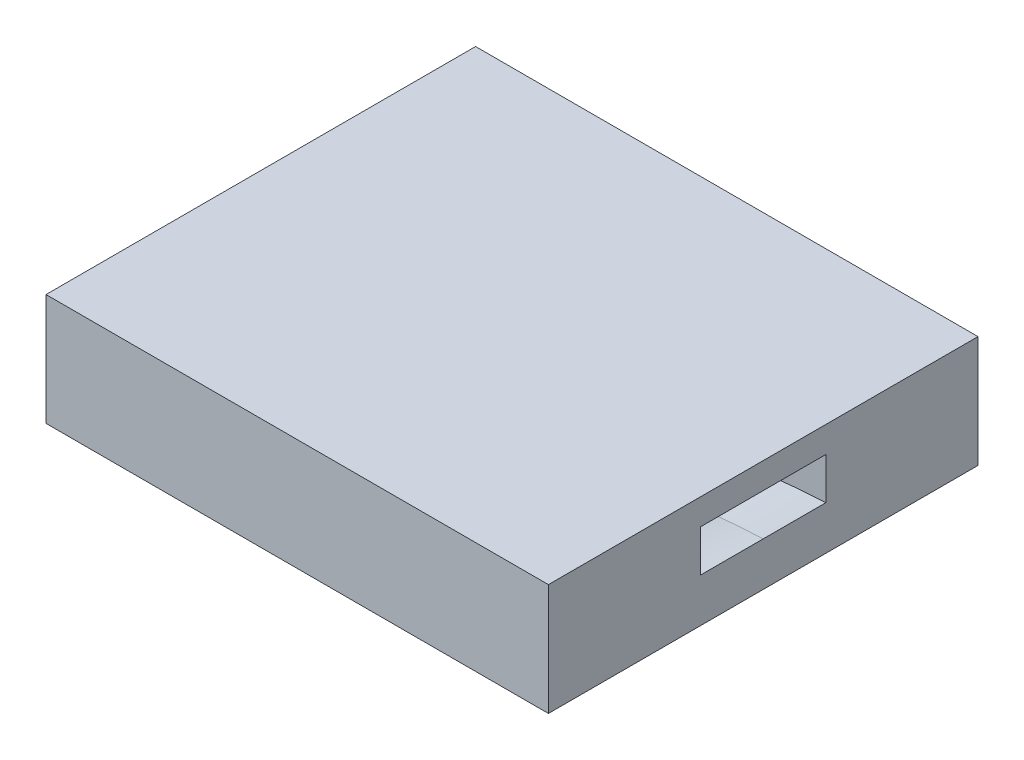
ISO-10303-21;
HEADER;
FILE_DESCRIPTION(('STEP AP214'),'2;1');
FILE_NAME('part.step','',(''),(''),'','','');
FILE_SCHEMA(('AUTOMOTIVE_DESIGN { 1 0 10303 214 1 1 1 1 }'));
ENDSEC;
DATA;
#1=APPLICATION_CONTEXT('core data for automotive mechanical design processes');
#2=APPLICATION_PROTOCOL_DEFINITION('international standard','automotive_design',2000,#1);
#3=PRODUCT_CONTEXT('',#1,'mechanical');
#4=PRODUCT('Part','Part','',(#3));
#5=PRODUCT_RELATED_PRODUCT_CATEGORY('part','',(#4));
#6=PRODUCT_DEFINITION_FORMATION('','',#4);
#7=PRODUCT_DEFINITION_CONTEXT('part definition',#1,'design');
#8=PRODUCT_DEFINITION('design','',#6,#7);
#9=PRODUCT_DEFINITION_SHAPE('','',#8);
#10=(LENGTH_UNIT() NAMED_UNIT(*) SI_UNIT(.MILLI.,.METRE.));
#11=(NAMED_UNIT(*) PLANE_ANGLE_UNIT() SI_UNIT($,.RADIAN.));
#12=(NAMED_UNIT(*) SI_UNIT($,.STERADIAN.) SOLID_ANGLE_UNIT());
#13=UNCERTAINTY_MEASURE_WITH_UNIT(LENGTH_MEASURE(1.E-05),#10,'distance_accuracy_value','');
#14=(GEOMETRIC_REPRESENTATION_CONTEXT(3) GLOBAL_UNCERTAINTY_ASSIGNED_CONTEXT((#13)) GLOBAL_UNIT_ASSIGNED_CONTEXT((#10,
#11,#12)) REPRESENTATION_CONTEXT('',''));
#15=CARTESIAN_POINT('',(0.,0.,0.));
#16=DIRECTION('',(0.,0.,1.));
#17=DIRECTION('',(1.,0.,0.));
#18=AXIS2_PLACEMENT_3D('',#15,#16,#17);
#19=CARTESIAN_POINT('',(40.5114922655486,18.,-34.6394807536539));
#20=DIRECTION('',(-1.,0.,0.));
#21=DIRECTION('',(0.,0.,1.));
#22=AXIS2_PLACEMENT_3D('',#19,#20,#21);
#23=PLANE('',#22);
#24=DIRECTION('',(0.,-1.,0.));
#25=VECTOR('',#24,1.);
#26=CARTESIAN_POINT('',(40.5114922655486,13.8041420215105,10.1010165580472));
#27=LINE('',#26,#25);
#28=CARTESIAN_POINT('',(40.5114922655486,13.8041420215105,10.1010165580472));
#29=VERTEX_POINT('',#28);
#30=CARTESIAN_POINT('',(40.5114922655486,7.07013098281241,10.1010165580472));
#31=VERTEX_POINT('',#30);
#32=EDGE_CURVE('E89',#29,#31,#27,.T.);
#33=ORIENTED_EDGE('',*,*,#32,.F.);
#34=DIRECTION('',(0.,0.,1.));
#35=VECTOR('',#34,1.);
#36=CARTESIAN_POINT('',(40.5114922655486,13.8041420215105,10.1010165580472));
#37=LINE('',#36,#35);
#38=CARTESIAN_POINT('',(40.5114922655486,13.8041420215105,0.));
#39=VERTEX_POINT('',#38);
#40=EDGE_CURVE('E243',#39,#29,#37,.T.);
#41=ORIENTED_EDGE('',*,*,#40,.F.);
#42=CARTESIAN_POINT('',(40.5114922655486,13.8041420215105,-10.1010165580472));
#43=VERTEX_POINT('',#42);
#44=EDGE_CURVE('E209',#43,#39,#37,.T.);
#45=ORIENTED_EDGE('',*,*,#44,.F.);
#46=DIRECTION('',(0.,1.,0.));
#47=VECTOR('',#46,1.);
#48=CARTESIAN_POINT('',(40.5114922655486,13.8041420215105,-10.1010165580472));
#49=LINE('',#48,#47);
#50=CARTESIAN_POINT('',(40.5114922655486,7.07013098281241,-10.1010165580472));
#51=VERTEX_POINT('',#50);
#52=EDGE_CURVE('E190',#51,#43,#49,.T.);
#53=ORIENTED_EDGE('',*,*,#52,.F.);
#54=DIRECTION('',(0.,0.,-1.));
#55=VECTOR('',#54,1.);
#56=CARTESIAN_POINT('',(40.5114922655486,7.07013098281241,10.1010165580472));
#57=LINE('',#56,#55);
#58=CARTESIAN_POINT('',(40.5114922655486,7.07013098281241,0.));
#59=VERTEX_POINT('',#58);
#60=EDGE_CURVE('E176',#59,#51,#57,.T.);
#61=ORIENTED_EDGE('',*,*,#60,.F.);
#62=EDGE_CURVE('E189',#31,#59,#57,.T.);
#63=ORIENTED_EDGE('',*,*,#62,.F.);
#64=EDGE_LOOP('',(#33,#41,#45,#53,#61,#63));
#65=FACE_BOUND('',#64,.T.);
#66=DIRECTION('',(0.,0.,-1.));
#67=VECTOR('',#66,1.);
#68=CARTESIAN_POINT('',(40.5114922655486,0.,-34.6394807536539));
#69=LINE('',#68,#67);
#70=CARTESIAN_POINT('',(40.5114922655486,0.,34.6394807536539));
#71=VERTEX_POINT('',#70);
#72=CARTESIAN_POINT('',(40.5114922655486,0.,-34.6394807536539));
#73=VERTEX_POINT('',#72);
#74=EDGE_CURVE('E305',#71,#73,#69,.T.);
#75=ORIENTED_EDGE('',*,*,#74,.T.);
#76=DIRECTION('',(0.,-1.,0.));
#77=VECTOR('',#76,1.);
#78=CARTESIAN_POINT('',(40.5114922655486,18.,-34.6394807536539));
#79=LINE('',#78,#77);
#80=CARTESIAN_POINT('',(40.5114922655486,18.,-34.6394807536539));
#81=VERTEX_POINT('',#80);
#82=EDGE_CURVE('E12',#81,#73,#79,.T.);
#83=ORIENTED_EDGE('',*,*,#82,.F.);
#84=DIRECTION('',(0.,0.,-1.));
#85=VECTOR('',#84,1.);
#86=CARTESIAN_POINT('',(40.5114922655486,18.,-34.6394807536539));
#87=LINE('',#86,#85);
#88=CARTESIAN_POINT('',(40.5114922655486,18.,34.6394807536539));
#89=VERTEX_POINT('',#88);
#90=EDGE_CURVE('E298',#89,#81,#87,.T.);
#91=ORIENTED_EDGE('',*,*,#90,.F.);
#92=DIRECTION('',(0.,-1.,0.));
#93=VECTOR('',#92,1.);
#94=CARTESIAN_POINT('',(40.5114922655486,18.,34.6394807536539));
#95=LINE('',#94,#93);
#96=EDGE_CURVE('E293',#89,#71,#95,.T.);
#97=ORIENTED_EDGE('',*,*,#96,.T.);
#98=EDGE_LOOP('',(#75,#83,#91,#97));
#99=FACE_BOUND('',#98,.T.);
#100=ADVANCED_FACE('F85',(#65,#99),#23,.F.);
#101=CARTESIAN_POINT('',(-40.5114922655486,18.,-34.6394807536539));
#102=DIRECTION('',(0.,0.,1.));
#103=DIRECTION('',(1.,0.,0.));
#104=AXIS2_PLACEMENT_3D('',#101,#102,#103);
#105=PLANE('',#104);
#106=DIRECTION('',(-1.,0.,0.));
#107=VECTOR('',#106,1.);
#108=CARTESIAN_POINT('',(-40.5114922655486,0.,-34.6394807536539));
#109=LINE('',#108,#107);
#110=CARTESIAN_POINT('',(-40.5114922655486,0.,-34.6394807536539));
#111=VERTEX_POINT('',#110);
#112=EDGE_CURVE('E302',#73,#111,#109,.T.);
#113=ORIENTED_EDGE('',*,*,#112,.T.);
#114=DIRECTION('',(0.,-1.,0.));
#115=VECTOR('',#114,1.);
#116=CARTESIAN_POINT('',(-40.5114922655486,18.,-34.6394807536539));
#117=LINE('',#116,#115);
#118=CARTESIAN_POINT('',(-40.5114922655486,18.,-34.6394807536539));
#119=VERTEX_POINT('',#118);
#120=EDGE_CURVE('E96',#119,#111,#117,.T.);
#121=ORIENTED_EDGE('',*,*,#120,.F.);
#122=DIRECTION('',(-1.,0.,0.));
#123=VECTOR('',#122,1.);
#124=CARTESIAN_POINT('',(-40.5114922655486,18.,-34.6394807536539));
#125=LINE('',#124,#123);
#126=EDGE_CURVE('E141',#81,#119,#125,.T.);
#127=ORIENTED_EDGE('',*,*,#126,.F.);
#128=ORIENTED_EDGE('',*,*,#82,.T.);
#129=EDGE_LOOP('',(#113,#121,#127,#128));
#130=FACE_BOUND('',#129,.T.);
#131=ADVANCED_FACE('F577',(#130),#105,.F.);
#132=CARTESIAN_POINT('',(-40.5114922655486,18.,-34.6394807536539));
#133=DIRECTION('',(1.,0.,0.));
#134=DIRECTION('',(0.,0.,-1.));
#135=AXIS2_PLACEMENT_3D('',#132,#133,#134);
#136=PLANE('',#135);
#137=DIRECTION('',(0.,0.,1.));
#138=VECTOR('',#137,1.);
#139=CARTESIAN_POINT('',(-40.5114922655486,0.,-34.6394807536539));
#140=LINE('',#139,#138);
#141=CARTESIAN_POINT('',(-40.5114922655486,0.,34.6394807536539));
#142=VERTEX_POINT('',#141);
#143=EDGE_CURVE('E299',#111,#142,#140,.T.);
#144=ORIENTED_EDGE('',*,*,#143,.T.);
#145=DIRECTION('',(0.,-1.,0.));
#146=VECTOR('',#145,1.);
#147=CARTESIAN_POINT('',(-40.5114922655486,18.,34.6394807536539));
#148=LINE('',#147,#146);
#149=CARTESIAN_POINT('',(-40.5114922655486,18.,34.6394807536539));
#150=VERTEX_POINT('',#149);
#151=EDGE_CURVE('E290',#150,#142,#148,.T.);
#152=ORIENTED_EDGE('',*,*,#151,.F.);
#153=DIRECTION('',(0.,0.,1.));
#154=VECTOR('',#153,1.);
#155=CARTESIAN_POINT('',(-40.5114922655486,18.,-34.6394807536539));
#156=LINE('',#155,#154);
#157=EDGE_CURVE('E312',#119,#150,#156,.T.);
#158=ORIENTED_EDGE('',*,*,#157,.F.);
#159=ORIENTED_EDGE('',*,*,#120,.T.);
#160=EDGE_LOOP('',(#144,#152,#158,#159));
#161=FACE_BOUND('',#160,.T.);
#162=ADVANCED_FACE('F581',(#161),#136,.F.);
#163=CARTESIAN_POINT('',(-40.5114922655486,18.,34.6394807536539));
#164=DIRECTION('',(0.,0.,-1.));
#165=DIRECTION('',(-1.,0.,0.));
#166=AXIS2_PLACEMENT_3D('',#163,#164,#165);
#167=PLANE('',#166);
#168=DIRECTION('',(1.,0.,0.));
#169=VECTOR('',#168,1.);
#170=CARTESIAN_POINT('',(-40.5114922655486,0.,34.6394807536539));
#171=LINE('',#170,#169);
#172=EDGE_CURVE('E134',#142,#71,#171,.T.);
#173=ORIENTED_EDGE('',*,*,#172,.T.);
#174=ORIENTED_EDGE('',*,*,#96,.F.);
#175=DIRECTION('',(1.,0.,0.));
#176=VECTOR('',#175,1.);
#177=CARTESIAN_POINT('',(-40.5114922655486,18.,34.6394807536539));
#178=LINE('',#177,#176);
#179=EDGE_CURVE('E113',#150,#89,#178,.T.);
#180=ORIENTED_EDGE('',*,*,#179,.F.);
#181=ORIENTED_EDGE('',*,*,#151,.T.);
#182=EDGE_LOOP('',(#173,#174,#180,#181));
#183=FACE_BOUND('',#182,.T.);
#184=ADVANCED_FACE('F585',(#183),#167,.F.);
#185=CARTESIAN_POINT('',(0.,18.,0.));
#186=DIRECTION('',(0.,1.,0.));
#187=DIRECTION('',(0.,0.,1.));
#188=AXIS2_PLACEMENT_3D('',#185,#186,#187);
#189=PLANE('',#188);
#190=ORIENTED_EDGE('',*,*,#90,.T.);
#191=ORIENTED_EDGE('',*,*,#126,.T.);
#192=ORIENTED_EDGE('',*,*,#157,.T.);
#193=ORIENTED_EDGE('',*,*,#179,.T.);
#194=EDGE_LOOP('',(#190,#191,#192,#193));
#195=FACE_BOUND('',#194,.T.);
#196=ADVANCED_FACE('F343',(#195),#189,.T.);
#197=CARTESIAN_POINT('',(0.,0.,0.));
#198=DIRECTION('',(0.,1.,0.));
#199=DIRECTION('',(0.,0.,1.));
#200=AXIS2_PLACEMENT_3D('',#197,#198,#199);
#201=PLANE('',#200);
#202=ORIENTED_EDGE('',*,*,#74,.F.);
#203=ORIENTED_EDGE('',*,*,#172,.F.);
#204=ORIENTED_EDGE('',*,*,#143,.F.);
#205=ORIENTED_EDGE('',*,*,#112,.F.);
#206=EDGE_LOOP('',(#202,#203,#204,#205));
#207=FACE_BOUND('',#206,.T.);
#208=ADVANCED_FACE('F336',(#207),#201,.F.);
#209=CARTESIAN_POINT('',(-24.4885077344514,9.26129754584731,25.9804417014075));
#210=DIRECTION('',(1.,0.,0.));
#211=DIRECTION('',(0.,0.,-1.));
#212=AXIS2_PLACEMENT_3D('',#209,#210,#211);
#213=PLANE('',#212);
#214=CARTESIAN_POINT('',(-24.4885077344514,9.26129754584731,25.9804417014075));
#215=DIRECTION('',(1.,0.,0.));
#216=DIRECTION('',(0.,0.,-1.));
#217=AXIS2_PLACEMENT_3D('',#214,#215,#216);
#218=CIRCLE('',#217,3.4390617686198);
#219=CARTESIAN_POINT('',(-24.4885077344514,7.5417666615374,28.9587565582161));
#220=VERTEX_POINT('',#219);
#221=CARTESIAN_POINT('',(-24.4885077344514,5.82223577722751,25.9804417014075));
#222=VERTEX_POINT('',#221);
#223=EDGE_CURVE('E309',#220,#222,#218,.T.);
#224=ORIENTED_EDGE('',*,*,#223,.T.);
#225=CARTESIAN_POINT('',(-24.4885077344514,7.54176666153744,23.0021268445989));
#226=VERTEX_POINT('',#225);
#227=EDGE_CURVE('E398',#222,#226,#218,.T.);
#228=ORIENTED_EDGE('',*,*,#227,.T.);
#229=CARTESIAN_POINT('',(-24.4885077344514,10.9808284301572,23.0021268445989));
#230=VERTEX_POINT('',#229);
#231=EDGE_CURVE('E200',#226,#230,#218,.T.);
#232=ORIENTED_EDGE('',*,*,#231,.T.);
#233=CARTESIAN_POINT('',(-24.4885077344514,12.7003593144671,25.9804417014075));
#234=VERTEX_POINT('',#233);
#235=EDGE_CURVE('E382',#230,#234,#218,.T.);
#236=ORIENTED_EDGE('',*,*,#235,.T.);
#237=CARTESIAN_POINT('',(-24.4885077344514,10.9808284301572,28.9587565582161));
#238=VERTEX_POINT('',#237);
#239=EDGE_CURVE('E374',#234,#238,#218,.T.);
#240=ORIENTED_EDGE('',*,*,#239,.T.);
#241=EDGE_CURVE('E383',#238,#220,#218,.T.);
#242=ORIENTED_EDGE('',*,*,#241,.T.);
#243=EDGE_LOOP('',(#224,#228,#232,#236,#240,#242));
#244=FACE_BOUND('',#243,.T.);
#245=ADVANCED_FACE('F325',(#244),#213,.T.);
#246=CARTESIAN_POINT('',(40.5114922655486,13.8041420215105,10.1010165580472));
#247=CARTESIAN_POINT('',(26.2652590417176,14.5078750939499,7.59727477368613));
#248=CARTESIAN_POINT('',(1.69629967471699,14.7834388296803,7.98696086227721));
#249=CARTESIAN_POINT('',(-17.0680742916158,12.6256660330477,20.1691014404654));
#250=CARTESIAN_POINT('',(-24.4885077344514,10.9808284301572,28.9587565582161));
#251=CARTESIAN_POINT('',(40.5114922655486,13.8041420215105,6.73401103869813));
#252=CARTESIAN_POINT('',(26.1994032451109,15.0724581055229,4.87805915649256));
#253=CARTESIAN_POINT('',(1.76416764547779,15.6997741748645,5.97217098392083));
#254=CARTESIAN_POINT('',(-17.1339300882224,14.0630841246415,19.4112405164155));
#255=CARTESIAN_POINT('',(-24.4885077344514,12.0447224973236,28.3445170321483));
#256=CARTESIAN_POINT('',(40.5114922655486,13.8041420215105,3.36700551934904));
#257=CARTESIAN_POINT('',(26.1335474485043,15.637041117096,2.15884353929899));
#258=CARTESIAN_POINT('',(1.83203561623858,16.8773199931211,4.29095471377893));
#259=CARTESIAN_POINT('',(-17.1997858848291,15.0922449662126,18.1320228398281));
#260=CARTESIAN_POINT('',(-24.4885077344514,12.7003593144671,27.208920753543));
#261=CARTESIAN_POINT('',(40.5114922655486,13.8041420215105,0.));
#262=CARTESIAN_POINT('',(26.0676916518976,16.2016241286691,-0.560372077894577));
#263=CARTESIAN_POINT('',(1.89990358699937,18.4743542666597,2.66916654494503));
#264=CARTESIAN_POINT('',(-17.2656416814357,15.4657689906401,16.7599223897105));
#265=CARTESIAN_POINT('',(-24.4885077344514,12.7003593144671,25.9804417014075));
#266=B_SPLINE_SURFACE_WITH_KNOTS('',3,3,((#246,#247,#248,#249,#250),(#251,#252,#253,#254,#255),
(#256,#257,#258,#259,#260),(#261,#262,#263,#264,#265)),.UNSPECIFIED.,.F.,.F.,.F.,(4,4),(4,1,4),
(0.,1.),(0.,0.561333604135169,1.),.UNSPECIFIED.);
#267=CARTESIAN_POINT('',(40.5114922655486,13.8041420215105,10.1010165580472));
#268=CARTESIAN_POINT('',(26.2652590417176,14.5078750939499,7.59727477368613));
#269=CARTESIAN_POINT('',(1.69629967471699,14.7834388296803,7.98696086227721));
#270=CARTESIAN_POINT('',(-17.0680742916158,12.6256660330477,20.1691014404654));
#271=CARTESIAN_POINT('',(-24.4885077344514,10.9808284301572,28.9587565582161));
#272=B_SPLINE_CURVE_WITH_KNOTS('',3,(#267,#268,#269,#270,#271),.UNSPECIFIED.,.F.,.F.,(4,1,4),
(0.,0.561333604135169,1.),.UNSPECIFIED.);
#273=EDGE_CURVE('E269',#238,#29,#272,.F.);
#274=CARTESIAN_POINT('',(40.5114922655486,13.8041420215105,0.));
#275=CARTESIAN_POINT('',(26.0676916518976,16.2016241286691,-0.560372077894577));
#276=CARTESIAN_POINT('',(1.89990358699937,18.4743542666597,2.66916654494503));
#277=CARTESIAN_POINT('',(-17.2656416814357,15.4657689906401,16.7599223897105));
#278=CARTESIAN_POINT('',(-24.4885077344514,12.7003593144671,25.9804417014075));
#279=B_SPLINE_CURVE_WITH_KNOTS('',3,(#274,#275,#276,#277,#278),.UNSPECIFIED.,.F.,.F.,(4,1,4),
(0.,0.561333604135169,1.),.UNSPECIFIED.);
#280=EDGE_CURVE('E506',#39,#234,#279,.T.);
#281=ORIENTED_EDGE('',*,*,#40,.T.);
#282=ORIENTED_EDGE('',*,*,#273,.F.);
#283=ORIENTED_EDGE('',*,*,#239,.F.);
#284=ORIENTED_EDGE('',*,*,#280,.F.);
#285=EDGE_LOOP('',(#281,#282,#283,#284));
#286=FACE_BOUND('',#285,.T.);
#287=ADVANCED_FACE('F335',(#286),#266,.F.);
#288=CARTESIAN_POINT('',(40.5114922655486,13.8041420215105,0.));
#289=CARTESIAN_POINT('',(26.0676916518976,16.2016241286691,-0.560372077894577));
#290=CARTESIAN_POINT('',(1.89990358699937,18.4743542666597,2.66916654494503));
#291=CARTESIAN_POINT('',(-17.2656416814357,15.4657689906401,16.7599223897105));
#292=CARTESIAN_POINT('',(-24.4885077344514,12.7003593144671,25.9804417014075));
#293=CARTESIAN_POINT('',(40.5114922655486,13.8041420215105,-3.36700551934911));
#294=CARTESIAN_POINT('',(26.0244323052657,15.6323016360664,-3.27666263562429));
#295=CARTESIAN_POINT('',(1.94448469031334,16.8822042854161,1.04436394366338));
#296=CARTESIAN_POINT('',(-17.3089010280676,15.087505485183,15.3907469990567));
#297=CARTESIAN_POINT('',(-24.4885077344514,12.7003593144671,24.751962649272));
#298=CARTESIAN_POINT('',(40.5114922655486,13.8041420215105,-6.73401103869816));
#299=CARTESIAN_POINT('',(25.9811729586338,15.0629791434637,-5.992953193354));
#300=CARTESIAN_POINT('',(1.98906579362733,15.7095427594544,-0.639866758926286));
#301=CARTESIAN_POINT('',(-17.3521603746995,14.0536051625823,14.1144543819331));
#302=CARTESIAN_POINT('',(-24.4885077344514,12.0447224973236,23.6163663706667));
#303=CARTESIAN_POINT('',(40.5114922655486,13.8041420215105,-10.1010165580472));
#304=CARTESIAN_POINT('',(25.9379136120019,14.4936566508609,-8.70924375108372));
#305=CARTESIAN_POINT('',(2.0336468969413,14.7980917065652,-2.65767106973041));
#306=CARTESIAN_POINT('',(-17.3954197213314,12.6114475899587,13.359518517347));
#307=CARTESIAN_POINT('',(-24.4885077344514,10.9808284301572,23.0021268445989));
#308=B_SPLINE_SURFACE_WITH_KNOTS('',3,3,((#288,#289,#290,#291,#292),(#293,#294,#295,#296,#297),
(#298,#299,#300,#301,#302),(#303,#304,#305,#306,#307)),.UNSPECIFIED.,.F.,.F.,.F.,(4,4),(4,1,4),
(0.,1.),(0.,0.561333604135169,1.),.UNSPECIFIED.);
#309=CARTESIAN_POINT('',(40.5114922655486,13.8041420215105,-10.1010165580472));
#310=CARTESIAN_POINT('',(25.9379136120019,14.4936566508609,-8.70924375108372));
#311=CARTESIAN_POINT('',(2.0336468969413,14.7980917065652,-2.65767106973041));
#312=CARTESIAN_POINT('',(-17.3954197213314,12.6114475899587,13.359518517347));
#313=CARTESIAN_POINT('',(-24.4885077344514,10.9808284301572,23.0021268445989));
#314=B_SPLINE_CURVE_WITH_KNOTS('',3,(#309,#310,#311,#312,#313),.UNSPECIFIED.,.F.,.F.,(4,1,4),
(0.,0.561333604135169,1.),.UNSPECIFIED.);
#315=EDGE_CURVE('E203',#43,#230,#314,.T.);
#316=ORIENTED_EDGE('',*,*,#44,.T.);
#317=ORIENTED_EDGE('',*,*,#280,.T.);
#318=ORIENTED_EDGE('',*,*,#235,.F.);
#319=ORIENTED_EDGE('',*,*,#315,.F.);
#320=EDGE_LOOP('',(#316,#317,#318,#319));
#321=FACE_BOUND('',#320,.T.);
#322=ADVANCED_FACE('F463',(#321),#308,.F.);
#323=CARTESIAN_POINT('',(40.5114922655486,7.07013098281241,10.1010165580472));
#324=CARTESIAN_POINT('',(26.2915737602995,7.5820468351042,7.58964037182155));
#325=CARTESIAN_POINT('',(1.66918092977238,8.17568667583565,7.99482852752791));
#326=CARTESIAN_POINT('',(-17.0417595730338,7.89647062092087,20.1614670386008));
#327=CARTESIAN_POINT('',(-24.4885077344514,7.5417666615374,28.9587565582161));
#328=CARTESIAN_POINT('',(40.5114922655486,9.31480132904512,10.1010165580472));
#329=CARTESIAN_POINT('',(26.2828021874389,9.89065625471943,7.59218517244308));
#330=CARTESIAN_POINT('',(1.67822051142058,10.4310300545204,7.59920426292186));
#331=CARTESIAN_POINT('',(-17.0505311458945,9.39040923592289,20.7782513652901));
#332=CARTESIAN_POINT('',(-24.4885077344514,8.60566072870376,29.5729960842838));
#333=CARTESIAN_POINT('',(40.5114922655486,11.5594716752778,10.1010165580472));
#334=CARTESIAN_POINT('',(26.2740306145782,12.1992656743347,7.5947299730646));
#335=CARTESIAN_POINT('',(1.68726009306879,12.5280954509956,7.5965817078383));
#336=CARTESIAN_POINT('',(-17.0593027187551,11.1317274180456,20.7807961659116));
#337=CARTESIAN_POINT('',(-24.4885077344514,9.91693436299083,29.5729960842838));
#338=CARTESIAN_POINT('',(40.5114922655486,13.8041420215105,10.1010165580472));
#339=CARTESIAN_POINT('',(26.2652590417176,14.5078750939499,7.59727477368613));
#340=CARTESIAN_POINT('',(1.69629967471699,14.7834388296803,7.98696086227721));
#341=CARTESIAN_POINT('',(-17.0680742916158,12.6256660330477,20.1691014404654));
#342=CARTESIAN_POINT('',(-24.4885077344514,10.9808284301572,28.9587565582161));
#343=B_SPLINE_SURFACE_WITH_KNOTS('',3,3,((#323,#324,#325,#326,#327),(#328,#329,#330,#331,#332),
(#333,#334,#335,#336,#337),(#338,#339,#340,#341,#342)),.UNSPECIFIED.,.F.,.F.,.F.,(4,4),(4,1,4),
(0.,1.),(0.,0.561333604135169,1.),.UNSPECIFIED.);
#344=CARTESIAN_POINT('',(40.5114922655486,7.07013098281241,10.1010165580472));
#345=CARTESIAN_POINT('',(26.2915737602995,7.5820468351042,7.58964037182155));
#346=CARTESIAN_POINT('',(1.66918092977238,8.17568667583565,7.99482852752791));
#347=CARTESIAN_POINT('',(-17.0417595730338,7.89647062092087,20.1614670386008));
#348=CARTESIAN_POINT('',(-24.4885077344514,7.5417666615374,28.9587565582161));
#349=B_SPLINE_CURVE_WITH_KNOTS('',3,(#344,#345,#346,#347,#348),.UNSPECIFIED.,.F.,.F.,(4,1,4),
(0.,0.561333604135169,1.),.UNSPECIFIED.);
#350=EDGE_CURVE('E104',#31,#220,#349,.T.);
#351=ORIENTED_EDGE('',*,*,#32,.T.);
#352=ORIENTED_EDGE('',*,*,#350,.T.);
#353=ORIENTED_EDGE('',*,*,#241,.F.);
#354=ORIENTED_EDGE('',*,*,#273,.T.);
#355=EDGE_LOOP('',(#351,#352,#353,#354));
#356=FACE_BOUND('',#355,.T.);
#357=ADVANCED_FACE('F272',(#356),#343,.F.);
#358=CARTESIAN_POINT('',(40.5114922655486,13.8041420215105,-10.1010165580472));
#359=CARTESIAN_POINT('',(25.9379136120019,14.4936566508609,-8.70924375108372));
#360=CARTESIAN_POINT('',(2.0336468969413,14.7980917065652,-2.65767106973041));
#361=CARTESIAN_POINT('',(-17.3954197213314,12.6114475899587,13.359518517347));
#362=CARTESIAN_POINT('',(-24.4885077344514,10.9808284301572,23.0021268445989));
#363=CARTESIAN_POINT('',(40.5114922655486,11.5594716752778,-10.1010165580472));
#364=CARTESIAN_POINT('',(25.945306084834,12.1905884511587,-8.7130085832108));
#365=CARTESIAN_POINT('',(2.02602855268209,12.5370378001758,-2.26078949647713));
#366=CARTESIAN_POINT('',(-17.3880272484994,11.1230501948697,12.7415141591522));
#367=CARTESIAN_POINT('',(-24.4885077344514,9.91693436299088,22.3878873185312));
#368=CARTESIAN_POINT('',(40.5114922655486,9.31480132904512,-10.1010165580472));
#369=CARTESIAN_POINT('',(25.952698557666,9.88752025145654,-8.71677341533787));
#370=CARTESIAN_POINT('',(2.01841020842287,10.4342618759959,-2.25690963274633));
#371=CARTESIAN_POINT('',(-17.3806347756673,9.38727323266003,12.7377493270251));
#372=CARTESIAN_POINT('',(-24.4885077344514,8.60566072870381,22.3878873185311));
#373=CARTESIAN_POINT('',(40.5114922655486,7.07013098281241,-10.1010165580472));
#374=CARTESIAN_POINT('',(25.960091030498,7.58445205175433,-8.72053824746494));
#375=CARTESIAN_POINT('',(2.01079186416365,8.17320796960648,-2.64603147853801));
#376=CARTESIAN_POINT('',(-17.3732423028353,7.89887583757102,13.3482240209658));
#377=CARTESIAN_POINT('',(-24.4885077344514,7.54176666153744,23.0021268445989));
#378=B_SPLINE_SURFACE_WITH_KNOTS('',3,3,((#358,#359,#360,#361,#362),(#363,#364,#365,#366,#367),
(#368,#369,#370,#371,#372),(#373,#374,#375,#376,#377)),.UNSPECIFIED.,.F.,.F.,.F.,(4,4),(4,1,4),
(0.,1.),(0.,0.561333604135169,1.),.UNSPECIFIED.);
#379=CARTESIAN_POINT('',(40.5114922655486,7.07013098281241,-10.1010165580472));
#380=CARTESIAN_POINT('',(25.960091030498,7.58445205175433,-8.72053824746494));
#381=CARTESIAN_POINT('',(2.01079186416365,8.17320796960648,-2.64603147853801));
#382=CARTESIAN_POINT('',(-17.3732423028353,7.89887583757102,13.3482240209658));
#383=CARTESIAN_POINT('',(-24.4885077344514,7.54176666153744,23.0021268445989));
#384=B_SPLINE_CURVE_WITH_KNOTS('',3,(#379,#380,#381,#382,#383),.UNSPECIFIED.,.F.,.F.,(4,1,4),
(0.,0.561333604135169,1.),.UNSPECIFIED.);
#385=EDGE_CURVE('E181',#51,#226,#384,.T.);
#386=ORIENTED_EDGE('',*,*,#52,.T.);
#387=ORIENTED_EDGE('',*,*,#315,.T.);
#388=ORIENTED_EDGE('',*,*,#231,.F.);
#389=ORIENTED_EDGE('',*,*,#385,.F.);
#390=EDGE_LOOP('',(#386,#387,#388,#389));
#391=FACE_BOUND('',#390,.T.);
#392=ADVANCED_FACE('F196',(#391),#378,.F.);
#393=CARTESIAN_POINT('',(40.5114922655486,7.07013098281241,-10.1010165580472));
#394=CARTESIAN_POINT('',(25.960091030498,7.58445205175433,-8.72053824746493));
#395=CARTESIAN_POINT('',(2.01079186416365,8.17320796960648,-2.64603147853802));
#396=CARTESIAN_POINT('',(-17.3732423028353,7.89887583757102,13.3482240209658));
#397=CARTESIAN_POINT('',(-24.4885077344514,7.54176666153744,23.0021268445989));
#398=CARTESIAN_POINT('',(40.5114922655486,7.07013098281241,-6.73401103869814));
#399=CARTESIAN_POINT('',(26.0049446573612,7.01692083807456,-6.00407485474732));
#400=CARTESIAN_POINT('',(1.96456776858937,7.25991090661889,-0.628405283564349));
#401=CARTESIAN_POINT('',(-17.3283886759721,6.45850954387042,14.1033327205397));
#402=CARTESIAN_POINT('',(-24.4885077344514,6.47787259437106,23.6163663706666));
#403=CARTESIAN_POINT('',(40.5114922655486,7.07013098281241,-3.36700551934907));
#404=CARTESIAN_POINT('',(26.0497982842244,6.44938962439478,-3.28761146202971));
#405=CARTESIAN_POINT('',(1.91834367301507,6.0854033705589,1.05564730319484));
#406=CARTESIAN_POINT('',(-17.2835350491089,5.42640050019264,15.3797981726512));
#407=CARTESIAN_POINT('',(-24.4885077344514,5.82223577722752,24.751962649272));
#408=CARTESIAN_POINT('',(40.5114922655486,7.07013098281241,0.));
#409=CARTESIAN_POINT('',(26.0946519110876,5.881858410715,-0.571148069312097));
#410=CARTESIAN_POINT('',(1.87211957744079,4.49140737921695,2.68027178864602));
#411=CARTESIAN_POINT('',(-17.2386814222457,5.04992827365841,16.7491463982929));
#412=CARTESIAN_POINT('',(-24.4885077344514,5.82223577722751,25.9804417014075));
#413=B_SPLINE_SURFACE_WITH_KNOTS('',3,3,((#393,#394,#395,#396,#397),(#398,#399,#400,#401,#402),
(#403,#404,#405,#406,#407),(#408,#409,#410,#411,#412)),.UNSPECIFIED.,.F.,.F.,.F.,(4,4),(4,1,4),
(0.,1.),(0.,0.561333604135169,1.),.UNSPECIFIED.);
#414=CARTESIAN_POINT('',(40.5114922655486,7.07013098281241,0.));
#415=CARTESIAN_POINT('',(26.0946519110876,5.881858410715,-0.571148069312097));
#416=CARTESIAN_POINT('',(1.87211957744079,4.49140737921695,2.68027178864602));
#417=CARTESIAN_POINT('',(-17.2386814222457,5.04992827365841,16.7491463982929));
#418=CARTESIAN_POINT('',(-24.4885077344514,5.82223577722751,25.9804417014075));
#419=B_SPLINE_CURVE_WITH_KNOTS('',3,(#414,#415,#416,#417,#418),.UNSPECIFIED.,.F.,.F.,(4,1,4),
(0.,0.561333604135169,1.),.UNSPECIFIED.);
#420=EDGE_CURVE('E183',#59,#222,#419,.T.);
#421=ORIENTED_EDGE('',*,*,#60,.T.);
#422=ORIENTED_EDGE('',*,*,#385,.T.);
#423=ORIENTED_EDGE('',*,*,#227,.F.);
#424=ORIENTED_EDGE('',*,*,#420,.F.);
#425=EDGE_LOOP('',(#421,#422,#423,#424));
#426=FACE_BOUND('',#425,.T.);
#427=ADVANCED_FACE('F179',(#426),#413,.F.);
#428=CARTESIAN_POINT('',(40.5114922655486,7.07013098281241,0.));
#429=CARTESIAN_POINT('',(26.0946519110876,5.881858410715,-0.571148069312098));
#430=CARTESIAN_POINT('',(1.87211957744079,4.49140737921694,2.68027178864602));
#431=CARTESIAN_POINT('',(-17.2386814222457,5.04992827365841,16.7491463982929));
#432=CARTESIAN_POINT('',(-24.4885077344514,5.82223577722752,25.9804417014075));
#433=CARTESIAN_POINT('',(40.5114922655486,7.07013098281241,3.36700551934908));
#434=CARTESIAN_POINT('',(26.1602925274916,6.4485878855114,2.14911474439912));
#435=CARTESIAN_POINT('',(1.80447336155132,6.08622960596862,4.30098076466316));
#436=CARTESIAN_POINT('',(-17.1730408058418,5.42559876130926,18.1222940449281));
#437=CARTESIAN_POINT('',(-24.4885077344514,5.82223577722751,27.208920753543));
#438=CARTESIAN_POINT('',(40.5114922655486,7.07013098281241,6.73401103869815));
#439=CARTESIAN_POINT('',(26.2259331438956,7.0153173603078,4.86937755811033));
#440=CARTESIAN_POINT('',(1.73682714566185,7.26156337743833,5.9811178419883));
#441=CARTESIAN_POINT('',(-17.1074001894378,6.45690606610364,19.4025589180333));
#442=CARTESIAN_POINT('',(-24.4885077344514,6.47787259437103,28.3445170321483));
#443=CARTESIAN_POINT('',(40.5114922655486,7.07013098281241,10.1010165580472));
#444=CARTESIAN_POINT('',(26.2915737602995,7.5820468351042,7.58964037182155));
#445=CARTESIAN_POINT('',(1.66918092977238,8.17568667583565,7.99482852752791));
#446=CARTESIAN_POINT('',(-17.0417595730338,7.89647062092087,20.1614670386008));
#447=CARTESIAN_POINT('',(-24.4885077344514,7.5417666615374,28.9587565582161));
#448=B_SPLINE_SURFACE_WITH_KNOTS('',3,3,((#428,#429,#430,#431,#432),(#433,#434,#435,#436,#437),
(#438,#439,#440,#441,#442),(#443,#444,#445,#446,#447)),.UNSPECIFIED.,.F.,.F.,.F.,(4,4),(4,1,4),
(0.,1.),(0.,0.561333604135169,1.),.UNSPECIFIED.);
#449=ORIENTED_EDGE('',*,*,#62,.T.);
#450=ORIENTED_EDGE('',*,*,#420,.T.);
#451=ORIENTED_EDGE('',*,*,#223,.F.);
#452=ORIENTED_EDGE('',*,*,#350,.F.);
#453=EDGE_LOOP('',(#449,#450,#451,#452));
#454=FACE_BOUND('',#453,.T.);
#455=ADVANCED_FACE('F338',(#454),#448,.F.);
#456=CLOSED_SHELL('',(#100,#131,#162,#184,#196,#208,#245,#287,#322,#357,#392,#427,#455));
#457=MANIFOLD_SOLID_BREP('B2',#456);
#458=ADVANCED_BREP_SHAPE_REPRESENTATION('',(#18,#457),#14);
#459=SHAPE_DEFINITION_REPRESENTATION(#9,#458);
ENDSEC;
END-ISO-10303-21;
